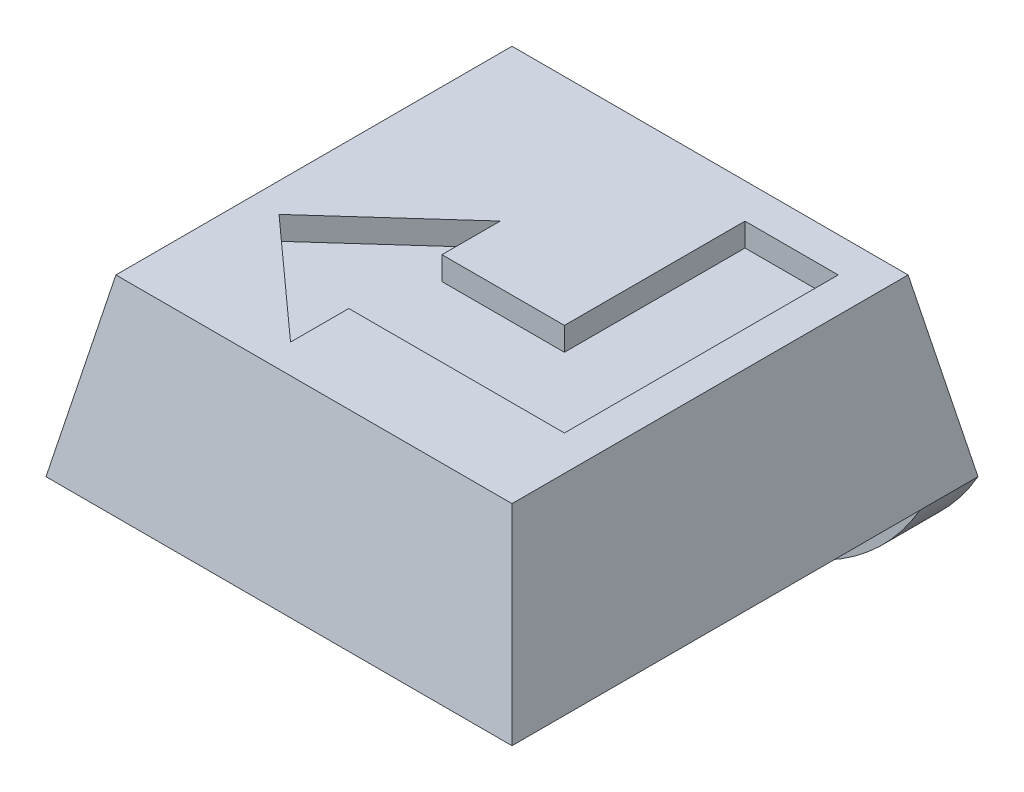
ISO-10303-21;
HEADER;
FILE_DESCRIPTION(('STEP AP214'),'2;1');
FILE_NAME('part.step','',(''),(''),'','','');
FILE_SCHEMA(('AUTOMOTIVE_DESIGN { 1 0 10303 214 1 1 1 1 }'));
ENDSEC;
DATA;
#1=APPLICATION_CONTEXT('core data for automotive mechanical design processes');
#2=APPLICATION_PROTOCOL_DEFINITION('international standard','automotive_design',2000,#1);
#3=PRODUCT_CONTEXT('',#1,'mechanical');
#4=PRODUCT('Part','Part','',(#3));
#5=PRODUCT_RELATED_PRODUCT_CATEGORY('part','',(#4));
#6=PRODUCT_DEFINITION_FORMATION('','',#4);
#7=PRODUCT_DEFINITION_CONTEXT('part definition',#1,'design');
#8=PRODUCT_DEFINITION('design','',#6,#7);
#9=PRODUCT_DEFINITION_SHAPE('','',#8);
#10=(LENGTH_UNIT() NAMED_UNIT(*) SI_UNIT(.MILLI.,.METRE.));
#11=(NAMED_UNIT(*) PLANE_ANGLE_UNIT() SI_UNIT($,.RADIAN.));
#12=(NAMED_UNIT(*) SI_UNIT($,.STERADIAN.) SOLID_ANGLE_UNIT());
#13=UNCERTAINTY_MEASURE_WITH_UNIT(LENGTH_MEASURE(1.E-05),#10,'distance_accuracy_value','');
#14=(GEOMETRIC_REPRESENTATION_CONTEXT(3) GLOBAL_UNCERTAINTY_ASSIGNED_CONTEXT((#13)) GLOBAL_UNIT_ASSIGNED_CONTEXT((#10,
#11,#12)) REPRESENTATION_CONTEXT('',''));
#15=CARTESIAN_POINT('',(0.,0.,0.));
#16=DIRECTION('',(0.,0.,1.));
#17=DIRECTION('',(1.,0.,0.));
#18=AXIS2_PLACEMENT_3D('',#15,#16,#17);
#19=CARTESIAN_POINT('',(0.,3.,0.));
#20=DIRECTION('',(0.,-1.,0.));
#21=DIRECTION('',(0.,0.,-1.));
#22=AXIS2_PLACEMENT_3D('',#19,#20,#21);
#23=PLANE('',#22);
#24=DIRECTION('',(-1.,0.,0.));
#25=VECTOR('',#24,1.);
#26=CARTESIAN_POINT('',(0.,3.,-2.1));
#27=LINE('',#26,#25);
#28=CARTESIAN_POINT('',(6.8,3.,-2.1));
#29=VERTEX_POINT('',#28);
#30=CARTESIAN_POINT('',(3.09782784027759,3.,-2.1));
#31=VERTEX_POINT('',#30);
#32=EDGE_CURVE('E240',#29,#31,#27,.T.);
#33=ORIENTED_EDGE('',*,*,#32,.T.);
#34=DIRECTION('',(0.,0.,-1.));
#35=VECTOR('',#34,1.);
#36=CARTESIAN_POINT('',(3.09782784027759,3.,0.));
#37=LINE('',#36,#35);
#38=CARTESIAN_POINT('',(3.09782784027759,3.,-1.1));
#39=VERTEX_POINT('',#38);
#40=EDGE_CURVE('E236',#39,#31,#37,.T.);
#41=ORIENTED_EDGE('',*,*,#40,.F.);
#42=DIRECTION('',(0.742932553355282,0.,0.669366283259772));
#43=VECTOR('',#42,1.);
#44=CARTESIAN_POINT('',(1.93500894894264,3.,-2.14767486076882));
#45=LINE('',#44,#43);
#46=CARTESIAN_POINT('',(1.1,3.,-2.9));
#47=VERTEX_POINT('',#46);
#48=EDGE_CURVE('E198',#47,#39,#45,.T.);
#49=ORIENTED_EDGE('',*,*,#48,.F.);
#50=DIRECTION('',(-0.742932553355282,0.,0.669366283259772));
#51=VECTOR('',#50,1.);
#52=CARTESIAN_POINT('',(-0.949296262379639,3.,-1.05362805647417));
#53=LINE('',#52,#51);
#54=CARTESIAN_POINT('',(3.09782784027759,3.,-4.7));
#55=VERTEX_POINT('',#54);
#56=EDGE_CURVE('E219',#55,#47,#53,.T.);
#57=ORIENTED_EDGE('',*,*,#56,.F.);
#58=CARTESIAN_POINT('',(3.09782784027759,3.,-3.7));
#59=VERTEX_POINT('',#58);
#60=EDGE_CURVE('E223',#59,#55,#37,.T.);
#61=ORIENTED_EDGE('',*,*,#60,.F.);
#62=DIRECTION('',(-1.,0.,0.));
#63=VECTOR('',#62,1.);
#64=CARTESIAN_POINT('',(0.,3.,-3.7));
#65=LINE('',#64,#63);
#66=CARTESIAN_POINT('',(5.2,3.,-3.7));
#67=VERTEX_POINT('',#66);
#68=EDGE_CURVE('E244',#67,#59,#65,.T.);
#69=ORIENTED_EDGE('',*,*,#68,.F.);
#70=DIRECTION('',(0.,0.,1.));
#71=VECTOR('',#70,1.);
#72=CARTESIAN_POINT('',(5.2,3.,-6.8));
#73=LINE('',#72,#71);
#74=CARTESIAN_POINT('',(5.2,3.,-6.8));
#75=VERTEX_POINT('',#74);
#76=EDGE_CURVE('E268',#75,#67,#73,.T.);
#77=ORIENTED_EDGE('',*,*,#76,.F.);
#78=DIRECTION('',(1.,0.,0.));
#79=VECTOR('',#78,1.);
#80=CARTESIAN_POINT('',(5.2,3.,-6.8));
#81=LINE('',#80,#79);
#82=CARTESIAN_POINT('',(6.8,3.,-6.8));
#83=VERTEX_POINT('',#82);
#84=EDGE_CURVE('E92',#75,#83,#81,.T.);
#85=ORIENTED_EDGE('',*,*,#84,.T.);
#86=DIRECTION('',(0.,0.,1.));
#87=VECTOR('',#86,1.);
#88=CARTESIAN_POINT('',(6.8,3.,-6.8));
#89=LINE('',#88,#87);
#90=EDGE_CURVE('E276',#83,#29,#89,.T.);
#91=ORIENTED_EDGE('',*,*,#90,.T.);
#92=EDGE_LOOP('',(#33,#41,#49,#57,#61,#69,#77,#85,#91));
#93=FACE_BOUND('',#92,.T.);
#94=DIRECTION('',(-1.,0.,0.));
#95=VECTOR('',#94,1.);
#96=CARTESIAN_POINT('',(11.,3.,-0.6));
#97=LINE('',#96,#95);
#98=CARTESIAN_POINT('',(7.4,3.,-0.6));
#99=VERTEX_POINT('',#98);
#100=CARTESIAN_POINT('',(0.6,3.,-0.6));
#101=VERTEX_POINT('',#100);
#102=EDGE_CURVE('E315',#99,#101,#97,.T.);
#103=ORIENTED_EDGE('',*,*,#102,.F.);
#104=DIRECTION('',(0.,0.,1.));
#105=VECTOR('',#104,1.);
#106=CARTESIAN_POINT('',(7.4,3.,-8.));
#107=LINE('',#106,#105);
#108=CARTESIAN_POINT('',(7.4,3.,-7.4));
#109=VERTEX_POINT('',#108);
#110=EDGE_CURVE('E328',#109,#99,#107,.T.);
#111=ORIENTED_EDGE('',*,*,#110,.F.);
#112=DIRECTION('',(-1.,0.,0.));
#113=VECTOR('',#112,1.);
#114=CARTESIAN_POINT('',(11.,3.,-7.4));
#115=LINE('',#114,#113);
#116=CARTESIAN_POINT('',(0.599999999999999,3.,-7.4));
#117=VERTEX_POINT('',#116);
#118=EDGE_CURVE('E311',#109,#117,#115,.T.);
#119=ORIENTED_EDGE('',*,*,#118,.T.);
#120=DIRECTION('',(0.,0.,1.));
#121=VECTOR('',#120,1.);
#122=CARTESIAN_POINT('',(0.6,3.,-8.));
#123=LINE('',#122,#121);
#124=EDGE_CURVE('E331',#117,#101,#123,.T.);
#125=ORIENTED_EDGE('',*,*,#124,.T.);
#126=EDGE_LOOP('',(#103,#111,#119,#125));
#127=FACE_BOUND('',#126,.T.);
#128=ADVANCED_FACE('F76',(#93,#127),#23,.F.);
#129=CARTESIAN_POINT('',(8.,0.,-8.));
#130=DIRECTION('',(-0.98058067569092,-0.196116135138184,0.));
#131=DIRECTION('',(0.196116135138184,-0.98058067569092,0.));
#132=AXIS2_PLACEMENT_3D('',#129,#130,#131);
#133=PLANE('',#132);
#134=DIRECTION('',(-0.192450089729875,0.962250448649376,-0.192450089729875));
#135=VECTOR('',#134,1.);
#136=CARTESIAN_POINT('',(7.7037037037037,1.48148148148148,-0.296296296296296));
#137=LINE('',#136,#135);
#138=CARTESIAN_POINT('',(8.,0.,0.));
#139=VERTEX_POINT('',#138);
#140=EDGE_CURVE('E325',#139,#99,#137,.T.);
#141=ORIENTED_EDGE('',*,*,#140,.F.);
#142=DIRECTION('',(0.,0.,-1.));
#143=VECTOR('',#142,1.);
#144=CARTESIAN_POINT('',(8.,0.,0.));
#145=LINE('',#144,#143);
#146=CARTESIAN_POINT('',(8.,0.,-7.));
#147=VERTEX_POINT('',#146);
#148=EDGE_CURVE('E344',#139,#147,#145,.T.);
#149=ORIENTED_EDGE('',*,*,#148,.T.);
#150=DIRECTION('',(0.,0.,1.));
#151=VECTOR('',#150,1.);
#152=CARTESIAN_POINT('',(8.,0.,-8.));
#153=LINE('',#152,#151);
#154=CARTESIAN_POINT('',(8.,0.,-8.));
#155=VERTEX_POINT('',#154);
#156=EDGE_CURVE('E251',#155,#147,#153,.T.);
#157=ORIENTED_EDGE('',*,*,#156,.F.);
#158=DIRECTION('',(0.192450089729875,-0.962250448649376,-0.192450089729875));
#159=VECTOR('',#158,1.);
#160=CARTESIAN_POINT('',(8.,0.,-8.));
#161=LINE('',#160,#159);
#162=EDGE_CURVE('E318',#109,#155,#161,.T.);
#163=ORIENTED_EDGE('',*,*,#162,.F.);
#164=ORIENTED_EDGE('',*,*,#110,.T.);
#165=EDGE_LOOP('',(#141,#149,#157,#163,#164));
#166=FACE_BOUND('',#165,.T.);
#167=ADVANCED_FACE('F412',(#166),#133,.F.);
#168=CARTESIAN_POINT('',(0.,0.,-8.));
#169=DIRECTION('',(0.98058067569092,-0.196116135138184,0.));
#170=DIRECTION('',(0.196116135138184,0.98058067569092,0.));
#171=AXIS2_PLACEMENT_3D('',#168,#169,#170);
#172=PLANE('',#171);
#173=DIRECTION('',(-0.192450089729875,-0.962250448649376,0.192450089729875));
#174=VECTOR('',#173,1.);
#175=CARTESIAN_POINT('',(0.296296296296296,1.48148148148148,-0.296296296296296));
#176=LINE('',#175,#174);
#177=CARTESIAN_POINT('',(0.,0.,0.));
#178=VERTEX_POINT('',#177);
#179=EDGE_CURVE('E372',#101,#178,#176,.T.);
#180=ORIENTED_EDGE('',*,*,#179,.F.);
#181=ORIENTED_EDGE('',*,*,#124,.F.);
#182=DIRECTION('',(0.192450089729875,0.962250448649376,0.192450089729875));
#183=VECTOR('',#182,1.);
#184=CARTESIAN_POINT('',(0.,0.,-8.));
#185=LINE('',#184,#183);
#186=CARTESIAN_POINT('',(0.,0.,-8.));
#187=VERTEX_POINT('',#186);
#188=EDGE_CURVE('E343',#187,#117,#185,.T.);
#189=ORIENTED_EDGE('',*,*,#188,.F.);
#190=DIRECTION('',(0.,0.,1.));
#191=VECTOR('',#190,1.);
#192=CARTESIAN_POINT('',(0.,0.,0.));
#193=LINE('',#192,#191);
#194=CARTESIAN_POINT('',(0.,0.,-7.));
#195=VERTEX_POINT('',#194);
#196=EDGE_CURVE('E348',#187,#195,#193,.T.);
#197=ORIENTED_EDGE('',*,*,#196,.T.);
#198=EDGE_CURVE('E335',#195,#178,#193,.T.);
#199=ORIENTED_EDGE('',*,*,#198,.T.);
#200=EDGE_LOOP('',(#180,#181,#189,#197,#199));
#201=FACE_BOUND('',#200,.T.);
#202=ADVANCED_FACE('F396',(#201),#172,.F.);
#203=CARTESIAN_POINT('',(0.,0.,0.));
#204=DIRECTION('',(0.,-1.,0.));
#205=DIRECTION('',(0.,0.,-1.));
#206=AXIS2_PLACEMENT_3D('',#203,#204,#205);
#207=PLANE('',#206);
#208=DIRECTION('',(-1.,0.,0.));
#209=VECTOR('',#208,1.);
#210=CARTESIAN_POINT('',(0.,0.,-7.));
#211=LINE('',#210,#209);
#212=EDGE_CURVE('E298',#147,#195,#211,.T.);
#213=ORIENTED_EDGE('',*,*,#212,.F.);
#214=ORIENTED_EDGE('',*,*,#148,.F.);
#215=DIRECTION('',(1.,0.,0.));
#216=VECTOR('',#215,1.);
#217=CARTESIAN_POINT('',(0.,0.,0.));
#218=LINE('',#217,#216);
#219=EDGE_CURVE('E345',#178,#139,#218,.T.);
#220=ORIENTED_EDGE('',*,*,#219,.F.);
#221=ORIENTED_EDGE('',*,*,#198,.F.);
#222=EDGE_LOOP('',(#213,#214,#220,#221));
#223=FACE_BOUND('',#222,.T.);
#224=CARTESIAN_POINT('',(4.,0.,-3.75));
#225=DIRECTION('',(0.,-1.,0.));
#226=DIRECTION('',(0.,0.,-1.));
#227=AXIS2_PLACEMENT_3D('',#224,#225,#226);
#228=CIRCLE('',#227,1.75);
#229=CARTESIAN_POINT('',(4.,0.,-5.5));
#230=VERTEX_POINT('',#229);
#231=EDGE_CURVE('E301',#230,#230,#228,.T.);
#232=ORIENTED_EDGE('',*,*,#231,.F.);
#233=EDGE_LOOP('',(#232));
#234=FACE_BOUND('',#233,.T.);
#235=ADVANCED_FACE('F407',(#223,#234),#207,.T.);
#236=CARTESIAN_POINT('',(11.,3.,-7.4));
#237=DIRECTION('',(0.,0.196116135138184,-0.98058067569092));
#238=DIRECTION('',(0.,0.98058067569092,0.196116135138184));
#239=AXIS2_PLACEMENT_3D('',#236,#237,#238);
#240=PLANE('',#239);
#241=ORIENTED_EDGE('',*,*,#162,.T.);
#242=DIRECTION('',(-1.,0.,0.));
#243=VECTOR('',#242,1.);
#244=CARTESIAN_POINT('',(0.,0.,-8.));
#245=LINE('',#244,#243);
#246=EDGE_CURVE('E339',#155,#187,#245,.T.);
#247=ORIENTED_EDGE('',*,*,#246,.T.);
#248=ORIENTED_EDGE('',*,*,#188,.T.);
#249=ORIENTED_EDGE('',*,*,#118,.F.);
#250=EDGE_LOOP('',(#241,#247,#248,#249));
#251=FACE_BOUND('',#250,.T.);
#252=ADVANCED_FACE('F391',(#251),#240,.T.);
#253=CARTESIAN_POINT('',(11.,0.,0.));
#254=DIRECTION('',(0.,0.196116135138184,0.98058067569092));
#255=DIRECTION('',(0.,-0.98058067569092,0.196116135138184));
#256=AXIS2_PLACEMENT_3D('',#253,#254,#255);
#257=PLANE('',#256);
#258=ORIENTED_EDGE('',*,*,#140,.T.);
#259=ORIENTED_EDGE('',*,*,#102,.T.);
#260=ORIENTED_EDGE('',*,*,#179,.T.);
#261=ORIENTED_EDGE('',*,*,#219,.T.);
#262=EDGE_LOOP('',(#258,#259,#260,#261));
#263=FACE_BOUND('',#262,.T.);
#264=ADVANCED_FACE('F436',(#263),#257,.T.);
#265=CARTESIAN_POINT('',(4.,0.4,-3.75));
#266=DIRECTION('',(0.,-1.,0.));
#267=DIRECTION('',(0.,0.,-1.));
#268=AXIS2_PLACEMENT_3D('',#265,#266,#267);
#269=CYLINDRICAL_SURFACE('',#268,1.75);
#270=CARTESIAN_POINT('',(4.,0.4,-3.75));
#271=DIRECTION('',(0.,-1.,0.));
#272=DIRECTION('',(0.,0.,-1.));
#273=AXIS2_PLACEMENT_3D('',#270,#271,#272);
#274=CIRCLE('',#273,1.75);
#275=CARTESIAN_POINT('',(4.,0.4,-5.5));
#276=VERTEX_POINT('',#275);
#277=EDGE_CURVE('E307',#276,#276,#274,.T.);
#278=ORIENTED_EDGE('',*,*,#277,.F.);
#279=EDGE_LOOP('',(#278));
#280=FACE_BOUND('',#279,.T.);
#281=ORIENTED_EDGE('',*,*,#231,.T.);
#282=EDGE_LOOP('',(#281));
#283=FACE_BOUND('',#282,.T.);
#284=ADVANCED_FACE('F443',(#280,#283),#269,.F.);
#285=CARTESIAN_POINT('',(4.,0.4,-3.75));
#286=DIRECTION('',(0.,-1.,0.));
#287=DIRECTION('',(0.,0.,-1.));
#288=AXIS2_PLACEMENT_3D('',#285,#286,#287);
#289=PLANE('',#288);
#290=ORIENTED_EDGE('',*,*,#277,.T.);
#291=EDGE_LOOP('',(#290));
#292=FACE_BOUND('',#291,.T.);
#293=ADVANCED_FACE('F447',(#292),#289,.T.);
#294=CARTESIAN_POINT('',(0.,-2.,-8.));
#295=DIRECTION('',(0.,0.,1.));
#296=DIRECTION('',(1.,0.,0.));
#297=AXIS2_PLACEMENT_3D('',#294,#295,#296);
#298=PLANE('',#297);
#299=ORIENTED_EDGE('',*,*,#246,.F.);
#300=CARTESIAN_POINT('',(4.53589838486225,2.,-8.));
#301=DIRECTION('',(0.,0.,1.));
#302=DIRECTION('',(1.,0.,0.));
#303=AXIS2_PLACEMENT_3D('',#300,#301,#302);
#304=CIRCLE('',#303,4.);
#305=CARTESIAN_POINT('',(4.53589838486225,-2.,-8.));
#306=VERTEX_POINT('',#305);
#307=EDGE_CURVE('E12',#155,#306,#304,.F.);
#308=ORIENTED_EDGE('',*,*,#307,.T.);
#309=DIRECTION('',(1.,0.,0.));
#310=VECTOR('',#309,1.);
#311=CARTESIAN_POINT('',(0.,-2.,-8.));
#312=LINE('',#311,#310);
#313=CARTESIAN_POINT('',(3.46410161513775,-2.,-8.));
#314=VERTEX_POINT('',#313);
#315=EDGE_CURVE('E293',#314,#306,#312,.T.);
#316=ORIENTED_EDGE('',*,*,#315,.F.);
#317=CARTESIAN_POINT('',(3.46410161513775,2.,-8.));
#318=DIRECTION('',(0.,0.,1.));
#319=DIRECTION('',(1.,0.,0.));
#320=AXIS2_PLACEMENT_3D('',#317,#318,#319);
#321=CIRCLE('',#320,4.);
#322=EDGE_CURVE('E85',#314,#187,#321,.F.);
#323=ORIENTED_EDGE('',*,*,#322,.T.);
#324=EDGE_LOOP('',(#299,#308,#316,#323));
#325=FACE_BOUND('',#324,.T.);
#326=ADVANCED_FACE('F384',(#325),#298,.F.);
#327=CARTESIAN_POINT('',(0.,-2.,-7.));
#328=DIRECTION('',(0.,0.,-1.));
#329=DIRECTION('',(-1.,0.,0.));
#330=AXIS2_PLACEMENT_3D('',#327,#328,#329);
#331=PLANE('',#330);
#332=DIRECTION('',(-1.,0.,0.));
#333=VECTOR('',#332,1.);
#334=CARTESIAN_POINT('',(0.,-2.,-7.));
#335=LINE('',#334,#333);
#336=CARTESIAN_POINT('',(4.53589838486225,-2.,-7.));
#337=VERTEX_POINT('',#336);
#338=CARTESIAN_POINT('',(3.46410161513775,-2.,-7.));
#339=VERTEX_POINT('',#338);
#340=EDGE_CURVE('E297',#337,#339,#335,.T.);
#341=ORIENTED_EDGE('',*,*,#340,.F.);
#342=CARTESIAN_POINT('',(4.53589838486225,2.,-7.));
#343=DIRECTION('',(0.,0.,-1.));
#344=DIRECTION('',(-1.,0.,0.));
#345=AXIS2_PLACEMENT_3D('',#342,#343,#344);
#346=CIRCLE('',#345,4.);
#347=EDGE_CURVE('E378',#337,#147,#346,.F.);
#348=ORIENTED_EDGE('',*,*,#347,.T.);
#349=ORIENTED_EDGE('',*,*,#212,.T.);
#350=CARTESIAN_POINT('',(3.46410161513775,2.,-7.));
#351=DIRECTION('',(0.,0.,-1.));
#352=DIRECTION('',(-1.,0.,0.));
#353=AXIS2_PLACEMENT_3D('',#350,#351,#352);
#354=CIRCLE('',#353,4.);
#355=EDGE_CURVE('E100',#195,#339,#354,.F.);
#356=ORIENTED_EDGE('',*,*,#355,.T.);
#357=EDGE_LOOP('',(#341,#348,#349,#356));
#358=FACE_BOUND('',#357,.T.);
#359=ADVANCED_FACE('F402',(#358),#331,.F.);
#360=CARTESIAN_POINT('',(0.,-2.,0.));
#361=DIRECTION('',(0.,1.,0.));
#362=DIRECTION('',(0.,0.,1.));
#363=AXIS2_PLACEMENT_3D('',#360,#361,#362);
#364=PLANE('',#363);
#365=ORIENTED_EDGE('',*,*,#315,.T.);
#366=DIRECTION('',(0.,0.,1.));
#367=VECTOR('',#366,1.);
#368=CARTESIAN_POINT('',(4.53589838486225,-2.,0.));
#369=LINE('',#368,#367);
#370=EDGE_CURVE('E371',#306,#337,#369,.T.);
#371=ORIENTED_EDGE('',*,*,#370,.T.);
#372=ORIENTED_EDGE('',*,*,#340,.T.);
#373=DIRECTION('',(0.,0.,-1.));
#374=VECTOR('',#373,1.);
#375=CARTESIAN_POINT('',(3.46410161513775,-2.,0.));
#376=LINE('',#375,#374);
#377=EDGE_CURVE('E367',#339,#314,#376,.T.);
#378=ORIENTED_EDGE('',*,*,#377,.T.);
#379=EDGE_LOOP('',(#365,#371,#372,#378));
#380=FACE_BOUND('',#379,.T.);
#381=ADVANCED_FACE('F400',(#380),#364,.F.);
#382=CARTESIAN_POINT('',(4.53589838486225,2.,-8.));
#383=DIRECTION('',(0.,0.,1.));
#384=DIRECTION('',(1.,0.,0.));
#385=AXIS2_PLACEMENT_3D('',#382,#383,#384);
#386=CYLINDRICAL_SURFACE('',#385,4.);
#387=ORIENTED_EDGE('',*,*,#307,.F.);
#388=ORIENTED_EDGE('',*,*,#156,.T.);
#389=ORIENTED_EDGE('',*,*,#347,.F.);
#390=ORIENTED_EDGE('',*,*,#370,.F.);
#391=EDGE_LOOP('',(#387,#388,#389,#390));
#392=FACE_BOUND('',#391,.T.);
#393=ADVANCED_FACE('F413',(#392),#386,.T.);
#394=CARTESIAN_POINT('',(3.46410161513775,2.,-8.));
#395=DIRECTION('',(0.,0.,-1.));
#396=DIRECTION('',(-1.,0.,0.));
#397=AXIS2_PLACEMENT_3D('',#394,#395,#396);
#398=CYLINDRICAL_SURFACE('',#397,4.);
#399=ORIENTED_EDGE('',*,*,#355,.F.);
#400=ORIENTED_EDGE('',*,*,#196,.F.);
#401=ORIENTED_EDGE('',*,*,#322,.F.);
#402=ORIENTED_EDGE('',*,*,#377,.F.);
#403=EDGE_LOOP('',(#399,#400,#401,#402));
#404=FACE_BOUND('',#403,.T.);
#405=ADVANCED_FACE('F78',(#404),#398,.T.);
#406=CARTESIAN_POINT('',(1.93500894894264,2.6,-2.14767486076882));
#407=DIRECTION('',(-0.669366283259772,0.,0.742932553355282));
#408=DIRECTION('',(0.742932553355282,0.,0.669366283259772));
#409=AXIS2_PLACEMENT_3D('',#406,#407,#408);
#410=PLANE('',#409);
#411=ORIENTED_EDGE('',*,*,#48,.T.);
#412=DIRECTION('',(0.,1.,0.));
#413=VECTOR('',#412,1.);
#414=CARTESIAN_POINT('',(3.09782784027759,2.6,-1.1));
#415=LINE('',#414,#413);
#416=CARTESIAN_POINT('',(3.09782784027759,2.6,-1.1));
#417=VERTEX_POINT('',#416);
#418=EDGE_CURVE('E191',#417,#39,#415,.T.);
#419=ORIENTED_EDGE('',*,*,#418,.F.);
#420=DIRECTION('',(0.742932553355282,0.,0.669366283259772));
#421=VECTOR('',#420,1.);
#422=CARTESIAN_POINT('',(1.93500894894264,2.6,-2.14767486076882));
#423=LINE('',#422,#421);
#424=CARTESIAN_POINT('',(1.1,2.6,-2.9));
#425=VERTEX_POINT('',#424);
#426=EDGE_CURVE('E195',#425,#417,#423,.T.);
#427=ORIENTED_EDGE('',*,*,#426,.F.);
#428=DIRECTION('',(0.,1.,0.));
#429=VECTOR('',#428,1.);
#430=CARTESIAN_POINT('',(1.1,2.6,-2.9));
#431=LINE('',#430,#429);
#432=EDGE_CURVE('E248',#425,#47,#431,.T.);
#433=ORIENTED_EDGE('',*,*,#432,.T.);
#434=EDGE_LOOP('',(#411,#419,#427,#433));
#435=FACE_BOUND('',#434,.T.);
#436=ADVANCED_FACE('F193',(#435),#410,.F.);
#437=CARTESIAN_POINT('',(-0.949296262379639,2.6,-1.05362805647417));
#438=DIRECTION('',(-0.669366283259772,0.,-0.742932553355282));
#439=DIRECTION('',(-0.742932553355282,0.,0.669366283259772));
#440=AXIS2_PLACEMENT_3D('',#437,#438,#439);
#441=PLANE('',#440);
#442=ORIENTED_EDGE('',*,*,#56,.T.);
#443=ORIENTED_EDGE('',*,*,#432,.F.);
#444=DIRECTION('',(-0.742932553355282,0.,0.669366283259772));
#445=VECTOR('',#444,1.);
#446=CARTESIAN_POINT('',(-0.949296262379639,2.6,-1.05362805647417));
#447=LINE('',#446,#445);
#448=CARTESIAN_POINT('',(3.09782784027759,2.6,-4.7));
#449=VERTEX_POINT('',#448);
#450=EDGE_CURVE('E204',#449,#425,#447,.T.);
#451=ORIENTED_EDGE('',*,*,#450,.F.);
#452=DIRECTION('',(0.,1.,0.));
#453=VECTOR('',#452,1.);
#454=CARTESIAN_POINT('',(3.09782784027759,2.6,-4.7));
#455=LINE('',#454,#453);
#456=EDGE_CURVE('E252',#449,#55,#455,.T.);
#457=ORIENTED_EDGE('',*,*,#456,.T.);
#458=EDGE_LOOP('',(#442,#443,#451,#457));
#459=FACE_BOUND('',#458,.T.);
#460=ADVANCED_FACE('F468',(#459),#441,.F.);
#461=CARTESIAN_POINT('',(3.09782784027759,2.6,0.));
#462=DIRECTION('',(1.,0.,0.));
#463=DIRECTION('',(0.,0.,-1.));
#464=AXIS2_PLACEMENT_3D('',#461,#462,#463);
#465=PLANE('',#464);
#466=ORIENTED_EDGE('',*,*,#60,.T.);
#467=ORIENTED_EDGE('',*,*,#456,.F.);
#468=DIRECTION('',(0.,0.,-1.));
#469=VECTOR('',#468,1.);
#470=CARTESIAN_POINT('',(3.09782784027759,2.6,0.));
#471=LINE('',#470,#469);
#472=CARTESIAN_POINT('',(3.09782784027759,2.6,-3.7));
#473=VERTEX_POINT('',#472);
#474=EDGE_CURVE('E214',#473,#449,#471,.T.);
#475=ORIENTED_EDGE('',*,*,#474,.F.);
#476=DIRECTION('',(0.,1.,0.));
#477=VECTOR('',#476,1.);
#478=CARTESIAN_POINT('',(3.09782784027759,2.6,-3.7));
#479=LINE('',#478,#477);
#480=EDGE_CURVE('E255',#473,#59,#479,.T.);
#481=ORIENTED_EDGE('',*,*,#480,.T.);
#482=EDGE_LOOP('',(#466,#467,#475,#481));
#483=FACE_BOUND('',#482,.T.);
#484=ADVANCED_FACE('F476',(#483),#465,.F.);
#485=CARTESIAN_POINT('',(0.,2.6,-3.7));
#486=DIRECTION('',(0.,0.,-1.));
#487=DIRECTION('',(-1.,0.,0.));
#488=AXIS2_PLACEMENT_3D('',#485,#486,#487);
#489=PLANE('',#488);
#490=ORIENTED_EDGE('',*,*,#68,.T.);
#491=ORIENTED_EDGE('',*,*,#480,.F.);
#492=DIRECTION('',(-1.,0.,0.));
#493=VECTOR('',#492,1.);
#494=CARTESIAN_POINT('',(0.,2.6,-3.7));
#495=LINE('',#494,#493);
#496=CARTESIAN_POINT('',(5.2,2.6,-3.7));
#497=VERTEX_POINT('',#496);
#498=EDGE_CURVE('E228',#497,#473,#495,.T.);
#499=ORIENTED_EDGE('',*,*,#498,.F.);
#500=DIRECTION('',(0.,1.,0.));
#501=VECTOR('',#500,1.);
#502=CARTESIAN_POINT('',(5.2,2.6,-3.7));
#503=LINE('',#502,#501);
#504=EDGE_CURVE('E258',#497,#67,#503,.T.);
#505=ORIENTED_EDGE('',*,*,#504,.T.);
#506=EDGE_LOOP('',(#490,#491,#499,#505));
#507=FACE_BOUND('',#506,.T.);
#508=ADVANCED_FACE('F472',(#507),#489,.F.);
#509=CARTESIAN_POINT('',(0.,2.6,-2.1));
#510=DIRECTION('',(0.,0.,-1.));
#511=DIRECTION('',(-1.,0.,0.));
#512=AXIS2_PLACEMENT_3D('',#509,#510,#511);
#513=PLANE('',#512);
#514=ORIENTED_EDGE('',*,*,#32,.F.);
#515=DIRECTION('',(0.,1.,0.));
#516=VECTOR('',#515,1.);
#517=CARTESIAN_POINT('',(6.8,2.6,-2.1));
#518=LINE('',#517,#516);
#519=CARTESIAN_POINT('',(6.8,2.6,-2.1));
#520=VERTEX_POINT('',#519);
#521=EDGE_CURVE('E275',#520,#29,#518,.T.);
#522=ORIENTED_EDGE('',*,*,#521,.F.);
#523=DIRECTION('',(-1.,0.,0.));
#524=VECTOR('',#523,1.);
#525=CARTESIAN_POINT('',(0.,2.6,-2.1));
#526=LINE('',#525,#524);
#527=CARTESIAN_POINT('',(3.09782784027759,2.6,-2.1));
#528=VERTEX_POINT('',#527);
#529=EDGE_CURVE('E212',#520,#528,#526,.T.);
#530=ORIENTED_EDGE('',*,*,#529,.T.);
#531=DIRECTION('',(0.,1.,0.));
#532=VECTOR('',#531,1.);
#533=CARTESIAN_POINT('',(3.09782784027759,2.6,-2.1));
#534=LINE('',#533,#532);
#535=EDGE_CURVE('E203',#528,#31,#534,.T.);
#536=ORIENTED_EDGE('',*,*,#535,.T.);
#537=EDGE_LOOP('',(#514,#522,#530,#536));
#538=FACE_BOUND('',#537,.T.);
#539=ADVANCED_FACE('F469',(#538),#513,.T.);
#540=ORIENTED_EDGE('',*,*,#40,.T.);
#541=ORIENTED_EDGE('',*,*,#535,.F.);
#542=EDGE_CURVE('E208',#417,#528,#471,.T.);
#543=ORIENTED_EDGE('',*,*,#542,.F.);
#544=ORIENTED_EDGE('',*,*,#418,.T.);
#545=EDGE_LOOP('',(#540,#541,#543,#544));
#546=FACE_BOUND('',#545,.T.);
#547=ADVANCED_FACE('F209',(#546),#465,.F.);
#548=CARTESIAN_POINT('',(0.,2.6,0.));
#549=DIRECTION('',(0.,1.,0.));
#550=DIRECTION('',(0.,0.,1.));
#551=AXIS2_PLACEMENT_3D('',#548,#549,#550);
#552=PLANE('',#551);
#553=ORIENTED_EDGE('',*,*,#426,.T.);
#554=ORIENTED_EDGE('',*,*,#542,.T.);
#555=ORIENTED_EDGE('',*,*,#529,.F.);
#556=DIRECTION('',(0.,0.,1.));
#557=VECTOR('',#556,1.);
#558=CARTESIAN_POINT('',(6.8,2.6,-6.8));
#559=LINE('',#558,#557);
#560=CARTESIAN_POINT('',(6.8,2.6,-6.8));
#561=VERTEX_POINT('',#560);
#562=EDGE_CURVE('E263',#561,#520,#559,.T.);
#563=ORIENTED_EDGE('',*,*,#562,.F.);
#564=DIRECTION('',(1.,0.,0.));
#565=VECTOR('',#564,1.);
#566=CARTESIAN_POINT('',(5.2,2.6,-6.8));
#567=LINE('',#566,#565);
#568=CARTESIAN_POINT('',(5.2,2.6,-6.8));
#569=VERTEX_POINT('',#568);
#570=EDGE_CURVE('E267',#569,#561,#567,.T.);
#571=ORIENTED_EDGE('',*,*,#570,.F.);
#572=DIRECTION('',(0.,0.,1.));
#573=VECTOR('',#572,1.);
#574=CARTESIAN_POINT('',(5.2,2.6,-6.8));
#575=LINE('',#574,#573);
#576=EDGE_CURVE('E271',#569,#497,#575,.T.);
#577=ORIENTED_EDGE('',*,*,#576,.T.);
#578=ORIENTED_EDGE('',*,*,#498,.T.);
#579=ORIENTED_EDGE('',*,*,#474,.T.);
#580=ORIENTED_EDGE('',*,*,#450,.T.);
#581=EDGE_LOOP('',(#553,#554,#555,#563,#571,#577,#578,#579,#580));
#582=FACE_BOUND('',#581,.T.);
#583=ADVANCED_FACE('F215',(#582),#552,.T.);
#584=CARTESIAN_POINT('',(6.8,2.6,-6.8));
#585=DIRECTION('',(-1.,0.,0.));
#586=DIRECTION('',(0.,0.,1.));
#587=AXIS2_PLACEMENT_3D('',#584,#585,#586);
#588=PLANE('',#587);
#589=ORIENTED_EDGE('',*,*,#90,.F.);
#590=DIRECTION('',(0.,1.,0.));
#591=VECTOR('',#590,1.);
#592=CARTESIAN_POINT('',(6.8,2.6,-6.8));
#593=LINE('',#592,#591);
#594=EDGE_CURVE('E287',#561,#83,#593,.T.);
#595=ORIENTED_EDGE('',*,*,#594,.F.);
#596=ORIENTED_EDGE('',*,*,#562,.T.);
#597=ORIENTED_EDGE('',*,*,#521,.T.);
#598=EDGE_LOOP('',(#589,#595,#596,#597));
#599=FACE_BOUND('',#598,.T.);
#600=ADVANCED_FACE('F456',(#599),#588,.T.);
#601=CARTESIAN_POINT('',(5.2,2.6,-6.8));
#602=DIRECTION('',(0.,0.,1.));
#603=DIRECTION('',(1.,0.,0.));
#604=AXIS2_PLACEMENT_3D('',#601,#602,#603);
#605=PLANE('',#604);
#606=ORIENTED_EDGE('',*,*,#84,.F.);
#607=DIRECTION('',(0.,1.,0.));
#608=VECTOR('',#607,1.);
#609=CARTESIAN_POINT('',(5.2,2.6,-6.8));
#610=LINE('',#609,#608);
#611=EDGE_CURVE('E237',#569,#75,#610,.T.);
#612=ORIENTED_EDGE('',*,*,#611,.F.);
#613=ORIENTED_EDGE('',*,*,#570,.T.);
#614=ORIENTED_EDGE('',*,*,#594,.T.);
#615=EDGE_LOOP('',(#606,#612,#613,#614));
#616=FACE_BOUND('',#615,.T.);
#617=ADVANCED_FACE('F459',(#616),#605,.T.);
#618=CARTESIAN_POINT('',(5.2,2.6,-6.8));
#619=DIRECTION('',(-1.,0.,0.));
#620=DIRECTION('',(0.,0.,1.));
#621=AXIS2_PLACEMENT_3D('',#618,#619,#620);
#622=PLANE('',#621);
#623=ORIENTED_EDGE('',*,*,#576,.F.);
#624=ORIENTED_EDGE('',*,*,#611,.T.);
#625=ORIENTED_EDGE('',*,*,#76,.T.);
#626=ORIENTED_EDGE('',*,*,#504,.F.);
#627=EDGE_LOOP('',(#623,#624,#625,#626));
#628=FACE_BOUND('',#627,.T.);
#629=ADVANCED_FACE('F419',(#628),#622,.F.);
#630=CLOSED_SHELL('',(#128,#167,#202,#235,#252,#264,#284,#293,#326,#359,#381,#393,#405,#436,
#460,#484,#508,#539,#547,#583,#600,#617,#629));
#631=MANIFOLD_SOLID_BREP('B2',#630);
#632=ADVANCED_BREP_SHAPE_REPRESENTATION('',(#18,#631),#14);
#633=SHAPE_DEFINITION_REPRESENTATION(#9,#632);
ENDSEC;
END-ISO-10303-21;
